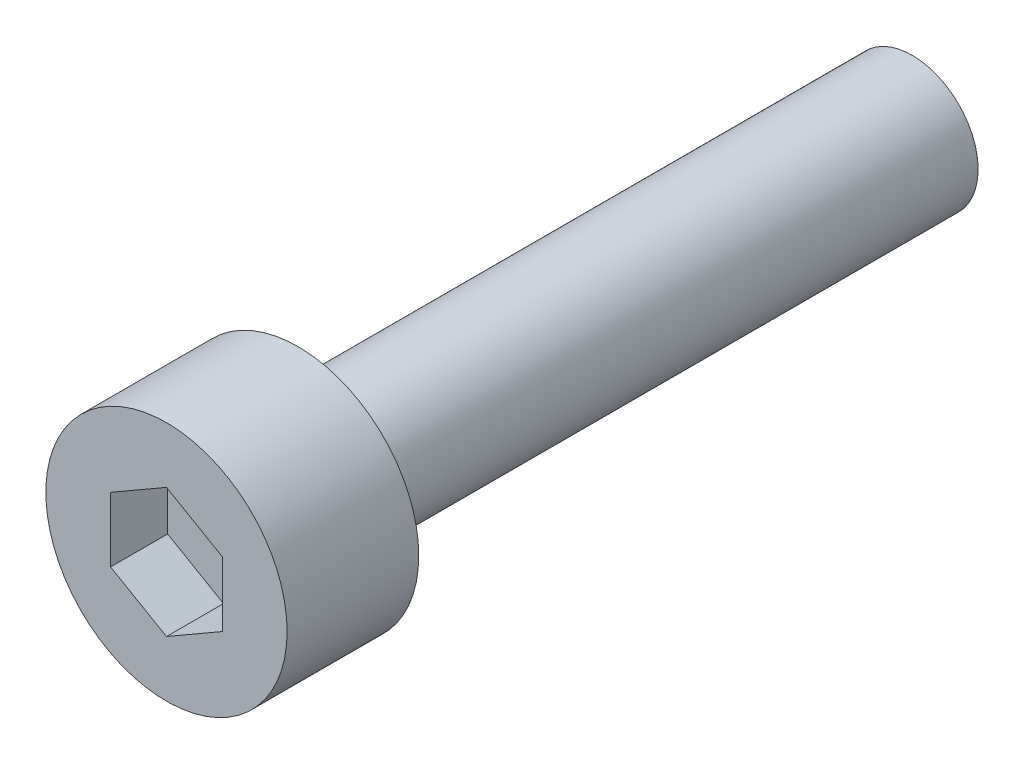
ISO-10303-21;
HEADER;
FILE_DESCRIPTION(('STEP AP214'),'2;1');
FILE_NAME('part.step','',(''),(''),'','','');
FILE_SCHEMA(('AUTOMOTIVE_DESIGN { 1 0 10303 214 1 1 1 1 }'));
ENDSEC;
DATA;
#1=APPLICATION_CONTEXT('core data for automotive mechanical design processes');
#2=APPLICATION_PROTOCOL_DEFINITION('international standard','automotive_design',2000,#1);
#3=PRODUCT_CONTEXT('',#1,'mechanical');
#4=PRODUCT('Part','Part','',(#3));
#5=PRODUCT_RELATED_PRODUCT_CATEGORY('part','',(#4));
#6=PRODUCT_DEFINITION_FORMATION('','',#4);
#7=PRODUCT_DEFINITION_CONTEXT('part definition',#1,'design');
#8=PRODUCT_DEFINITION('design','',#6,#7);
#9=PRODUCT_DEFINITION_SHAPE('','',#8);
#10=(LENGTH_UNIT() NAMED_UNIT(*) SI_UNIT(.MILLI.,.METRE.));
#11=(NAMED_UNIT(*) PLANE_ANGLE_UNIT() SI_UNIT($,.RADIAN.));
#12=(NAMED_UNIT(*) SI_UNIT($,.STERADIAN.) SOLID_ANGLE_UNIT());
#13=UNCERTAINTY_MEASURE_WITH_UNIT(LENGTH_MEASURE(1.E-05),#10,'distance_accuracy_value','');
#14=(GEOMETRIC_REPRESENTATION_CONTEXT(3) GLOBAL_UNCERTAINTY_ASSIGNED_CONTEXT((#13)) GLOBAL_UNIT_ASSIGNED_CONTEXT((#10,
#11,#12)) REPRESENTATION_CONTEXT('',''));
#15=CARTESIAN_POINT('',(0.,0.,0.));
#16=DIRECTION('',(0.,0.,1.));
#17=DIRECTION('',(1.,0.,0.));
#18=AXIS2_PLACEMENT_3D('',#15,#16,#17);
#19=CARTESIAN_POINT('',(0.,0.,3.));
#20=DIRECTION('',(0.,0.,-1.));
#21=DIRECTION('',(-1.,0.,0.));
#22=AXIS2_PLACEMENT_3D('',#19,#20,#21);
#23=CYLINDRICAL_SURFACE('',#22,2.75);
#24=CARTESIAN_POINT('',(0.,0.,3.));
#25=DIRECTION('',(0.,0.,1.));
#26=DIRECTION('',(1.,0.,0.));
#27=AXIS2_PLACEMENT_3D('',#24,#25,#26);
#28=CIRCLE('',#27,2.75);
#29=CARTESIAN_POINT('',(2.75,0.,3.));
#30=VERTEX_POINT('',#29);
#31=EDGE_CURVE('E51',#30,#30,#28,.T.);
#32=ORIENTED_EDGE('',*,*,#31,.F.);
#33=EDGE_LOOP('',(#32));
#34=FACE_BOUND('',#33,.T.);
#35=CARTESIAN_POINT('',(0.,0.,0.));
#36=DIRECTION('',(0.,0.,1.));
#37=DIRECTION('',(1.,0.,0.));
#38=AXIS2_PLACEMENT_3D('',#35,#36,#37);
#39=CIRCLE('',#38,2.75);
#40=CARTESIAN_POINT('',(2.75,0.,0.));
#41=VERTEX_POINT('',#40);
#42=EDGE_CURVE('E46',#41,#41,#39,.T.);
#43=ORIENTED_EDGE('',*,*,#42,.T.);
#44=EDGE_LOOP('',(#43));
#45=FACE_BOUND('',#44,.T.);
#46=ADVANCED_FACE('F43',(#34,#45),#23,.T.);
#47=CARTESIAN_POINT('',(0.,0.,3.));
#48=DIRECTION('',(0.,0.,1.));
#49=DIRECTION('',(1.,0.,0.));
#50=AXIS2_PLACEMENT_3D('',#47,#48,#49);
#51=PLANE('',#50);
#52=DIRECTION('',(0.866025403784439,0.5,0.));
#53=VECTOR('',#52,1.);
#54=CARTESIAN_POINT('',(0.,-1.47224318643355,3.));
#55=LINE('',#54,#53);
#56=CARTESIAN_POINT('',(0.,-1.47224318643355,3.));
#57=VERTEX_POINT('',#56);
#58=CARTESIAN_POINT('',(1.275,-0.736121593216773,3.));
#59=VERTEX_POINT('',#58);
#60=EDGE_CURVE('E59',#57,#59,#55,.T.);
#61=ORIENTED_EDGE('',*,*,#60,.F.);
#62=DIRECTION('',(0.866025403784439,-0.5,0.));
#63=VECTOR('',#62,1.);
#64=CARTESIAN_POINT('',(-1.275,-0.736121593216773,3.));
#65=LINE('',#64,#63);
#66=CARTESIAN_POINT('',(-1.275,-0.736121593216773,3.));
#67=VERTEX_POINT('',#66);
#68=EDGE_CURVE('E143',#67,#57,#65,.T.);
#69=ORIENTED_EDGE('',*,*,#68,.F.);
#70=DIRECTION('',(0.,-1.,0.));
#71=VECTOR('',#70,1.);
#72=CARTESIAN_POINT('',(-1.275,0.736121593216774,3.));
#73=LINE('',#72,#71);
#74=CARTESIAN_POINT('',(-1.275,0.736121593216774,3.));
#75=VERTEX_POINT('',#74);
#76=EDGE_CURVE('E141',#75,#67,#73,.T.);
#77=ORIENTED_EDGE('',*,*,#76,.F.);
#78=DIRECTION('',(-0.866025403784439,-0.5,0.));
#79=VECTOR('',#78,1.);
#80=CARTESIAN_POINT('',(0.,1.47224318643355,3.));
#81=LINE('',#80,#79);
#82=CARTESIAN_POINT('',(0.,1.47224318643355,3.));
#83=VERTEX_POINT('',#82);
#84=EDGE_CURVE('E107',#83,#75,#81,.T.);
#85=ORIENTED_EDGE('',*,*,#84,.F.);
#86=DIRECTION('',(-0.866025403784439,0.5,0.));
#87=VECTOR('',#86,1.);
#88=CARTESIAN_POINT('',(1.275,0.736121593216773,3.));
#89=LINE('',#88,#87);
#90=CARTESIAN_POINT('',(1.275,0.736121593216773,3.));
#91=VERTEX_POINT('',#90);
#92=EDGE_CURVE('E137',#91,#83,#89,.T.);
#93=ORIENTED_EDGE('',*,*,#92,.F.);
#94=DIRECTION('',(0.,1.,0.));
#95=VECTOR('',#94,1.);
#96=CARTESIAN_POINT('',(1.275,-0.736121593216773,3.));
#97=LINE('',#96,#95);
#98=EDGE_CURVE('E133',#59,#91,#97,.T.);
#99=ORIENTED_EDGE('',*,*,#98,.F.);
#100=EDGE_LOOP('',(#61,#69,#77,#85,#93,#99));
#101=FACE_BOUND('',#100,.T.);
#102=ORIENTED_EDGE('',*,*,#31,.T.);
#103=EDGE_LOOP('',(#102));
#104=FACE_BOUND('',#103,.T.);
#105=ADVANCED_FACE('F161',(#101,#104),#51,.T.);
#106=CARTESIAN_POINT('',(0.,0.,0.));
#107=DIRECTION('',(0.,0.,1.));
#108=DIRECTION('',(1.,0.,0.));
#109=AXIS2_PLACEMENT_3D('',#106,#107,#108);
#110=PLANE('',#109);
#111=CARTESIAN_POINT('',(0.,0.,0.));
#112=DIRECTION('',(0.,0.,-1.));
#113=DIRECTION('',(-1.,0.,0.));
#114=AXIS2_PLACEMENT_3D('',#111,#112,#113);
#115=CIRCLE('',#114,1.5);
#116=CARTESIAN_POINT('',(-1.5,0.,0.));
#117=VERTEX_POINT('',#116);
#118=EDGE_CURVE('E11',#117,#117,#115,.T.);
#119=ORIENTED_EDGE('',*,*,#118,.F.);
#120=EDGE_LOOP('',(#119));
#121=FACE_BOUND('',#120,.T.);
#122=ORIENTED_EDGE('',*,*,#42,.F.);
#123=EDGE_LOOP('',(#122));
#124=FACE_BOUND('',#123,.T.);
#125=ADVANCED_FACE('F158',(#121,#124),#110,.F.);
#126=CARTESIAN_POINT('',(0.,-1.47224318643355,1.7));
#127=DIRECTION('',(0.5,-0.866025403784439,0.));
#128=DIRECTION('',(0.866025403784439,0.5,0.));
#129=AXIS2_PLACEMENT_3D('',#126,#127,#128);
#130=PLANE('',#129);
#131=ORIENTED_EDGE('',*,*,#60,.T.);
#132=DIRECTION('',(0.,0.,1.));
#133=VECTOR('',#132,1.);
#134=CARTESIAN_POINT('',(1.275,-0.736121593216773,1.7));
#135=LINE('',#134,#133);
#136=CARTESIAN_POINT('',(1.275,-0.736121593216773,1.7));
#137=VERTEX_POINT('',#136);
#138=EDGE_CURVE('E89',#137,#59,#135,.T.);
#139=ORIENTED_EDGE('',*,*,#138,.F.);
#140=DIRECTION('',(0.866025403784439,0.5,0.));
#141=VECTOR('',#140,1.);
#142=CARTESIAN_POINT('',(0.,-1.47224318643355,1.7));
#143=LINE('',#142,#141);
#144=CARTESIAN_POINT('',(0.,-1.47224318643355,1.7));
#145=VERTEX_POINT('',#144);
#146=EDGE_CURVE('E145',#145,#137,#143,.T.);
#147=ORIENTED_EDGE('',*,*,#146,.F.);
#148=DIRECTION('',(0.,0.,1.));
#149=VECTOR('',#148,1.);
#150=CARTESIAN_POINT('',(0.,-1.47224318643355,1.7));
#151=LINE('',#150,#149);
#152=EDGE_CURVE('E67',#145,#57,#151,.T.);
#153=ORIENTED_EDGE('',*,*,#152,.T.);
#154=EDGE_LOOP('',(#131,#139,#147,#153));
#155=FACE_BOUND('',#154,.T.);
#156=ADVANCED_FACE('F160',(#155),#130,.F.);
#157=CARTESIAN_POINT('',(-1.275,-0.736121593216773,1.7));
#158=DIRECTION('',(-0.5,-0.866025403784439,0.));
#159=DIRECTION('',(0.866025403784439,-0.5,0.));
#160=AXIS2_PLACEMENT_3D('',#157,#158,#159);
#161=PLANE('',#160);
#162=ORIENTED_EDGE('',*,*,#68,.T.);
#163=ORIENTED_EDGE('',*,*,#152,.F.);
#164=DIRECTION('',(0.866025403784439,-0.5,0.));
#165=VECTOR('',#164,1.);
#166=CARTESIAN_POINT('',(-1.275,-0.736121593216773,1.7));
#167=LINE('',#166,#165);
#168=CARTESIAN_POINT('',(-1.275,-0.736121593216773,1.7));
#169=VERTEX_POINT('',#168);
#170=EDGE_CURVE('E119',#169,#145,#167,.T.);
#171=ORIENTED_EDGE('',*,*,#170,.F.);
#172=DIRECTION('',(0.,0.,1.));
#173=VECTOR('',#172,1.);
#174=CARTESIAN_POINT('',(-1.275,-0.736121593216773,1.7));
#175=LINE('',#174,#173);
#176=EDGE_CURVE('E111',#169,#67,#175,.T.);
#177=ORIENTED_EDGE('',*,*,#176,.T.);
#178=EDGE_LOOP('',(#162,#163,#171,#177));
#179=FACE_BOUND('',#178,.T.);
#180=ADVANCED_FACE('F168',(#179),#161,.F.);
#181=CARTESIAN_POINT('',(-1.275,0.736121593216774,1.7));
#182=DIRECTION('',(-1.,0.,0.));
#183=DIRECTION('',(0.,0.,1.));
#184=AXIS2_PLACEMENT_3D('',#181,#182,#183);
#185=PLANE('',#184);
#186=ORIENTED_EDGE('',*,*,#76,.T.);
#187=ORIENTED_EDGE('',*,*,#176,.F.);
#188=DIRECTION('',(0.,-1.,0.));
#189=VECTOR('',#188,1.);
#190=CARTESIAN_POINT('',(-1.275,0.736121593216774,1.7));
#191=LINE('',#190,#189);
#192=CARTESIAN_POINT('',(-1.275,0.736121593216774,1.7));
#193=VERTEX_POINT('',#192);
#194=EDGE_CURVE('E115',#193,#169,#191,.T.);
#195=ORIENTED_EDGE('',*,*,#194,.F.);
#196=DIRECTION('',(0.,0.,1.));
#197=VECTOR('',#196,1.);
#198=CARTESIAN_POINT('',(-1.275,0.736121593216774,1.7));
#199=LINE('',#198,#197);
#200=EDGE_CURVE('E100',#193,#75,#199,.T.);
#201=ORIENTED_EDGE('',*,*,#200,.T.);
#202=EDGE_LOOP('',(#186,#187,#195,#201));
#203=FACE_BOUND('',#202,.T.);
#204=ADVANCED_FACE('F116',(#203),#185,.F.);
#205=CARTESIAN_POINT('',(0.,1.47224318643355,1.7));
#206=DIRECTION('',(-0.5,0.866025403784439,0.));
#207=DIRECTION('',(-0.866025403784439,-0.5,0.));
#208=AXIS2_PLACEMENT_3D('',#205,#206,#207);
#209=PLANE('',#208);
#210=ORIENTED_EDGE('',*,*,#84,.T.);
#211=ORIENTED_EDGE('',*,*,#200,.F.);
#212=DIRECTION('',(-0.866025403784439,-0.5,0.));
#213=VECTOR('',#212,1.);
#214=CARTESIAN_POINT('',(0.,1.47224318643355,1.7));
#215=LINE('',#214,#213);
#216=CARTESIAN_POINT('',(0.,1.47224318643355,1.7));
#217=VERTEX_POINT('',#216);
#218=EDGE_CURVE('E104',#217,#193,#215,.T.);
#219=ORIENTED_EDGE('',*,*,#218,.F.);
#220=DIRECTION('',(0.,0.,1.));
#221=VECTOR('',#220,1.);
#222=CARTESIAN_POINT('',(0.,1.47224318643355,1.7));
#223=LINE('',#222,#221);
#224=EDGE_CURVE('E112',#217,#83,#223,.T.);
#225=ORIENTED_EDGE('',*,*,#224,.T.);
#226=EDGE_LOOP('',(#210,#211,#219,#225));
#227=FACE_BOUND('',#226,.T.);
#228=ADVANCED_FACE('F102',(#227),#209,.F.);
#229=CARTESIAN_POINT('',(1.275,0.736121593216773,1.7));
#230=DIRECTION('',(0.5,0.866025403784439,0.));
#231=DIRECTION('',(-0.866025403784439,0.5,0.));
#232=AXIS2_PLACEMENT_3D('',#229,#230,#231);
#233=PLANE('',#232);
#234=ORIENTED_EDGE('',*,*,#92,.T.);
#235=ORIENTED_EDGE('',*,*,#224,.F.);
#236=DIRECTION('',(-0.866025403784439,0.5,0.));
#237=VECTOR('',#236,1.);
#238=CARTESIAN_POINT('',(1.275,0.736121593216773,1.7));
#239=LINE('',#238,#237);
#240=CARTESIAN_POINT('',(1.275,0.736121593216773,1.7));
#241=VERTEX_POINT('',#240);
#242=EDGE_CURVE('E125',#241,#217,#239,.T.);
#243=ORIENTED_EDGE('',*,*,#242,.F.);
#244=DIRECTION('',(0.,0.,1.));
#245=VECTOR('',#244,1.);
#246=CARTESIAN_POINT('',(1.275,0.736121593216773,1.7));
#247=LINE('',#246,#245);
#248=EDGE_CURVE('E149',#241,#91,#247,.T.);
#249=ORIENTED_EDGE('',*,*,#248,.T.);
#250=EDGE_LOOP('',(#234,#235,#243,#249));
#251=FACE_BOUND('',#250,.T.);
#252=ADVANCED_FACE('F204',(#251),#233,.F.);
#253=CARTESIAN_POINT('',(1.275,-0.736121593216773,1.7));
#254=DIRECTION('',(1.,0.,0.));
#255=DIRECTION('',(0.,0.,-1.));
#256=AXIS2_PLACEMENT_3D('',#253,#254,#255);
#257=PLANE('',#256);
#258=ORIENTED_EDGE('',*,*,#98,.T.);
#259=ORIENTED_EDGE('',*,*,#248,.F.);
#260=DIRECTION('',(0.,1.,0.));
#261=VECTOR('',#260,1.);
#262=CARTESIAN_POINT('',(1.275,-0.736121593216773,1.7));
#263=LINE('',#262,#261);
#264=EDGE_CURVE('E127',#137,#241,#263,.T.);
#265=ORIENTED_EDGE('',*,*,#264,.F.);
#266=ORIENTED_EDGE('',*,*,#138,.T.);
#267=EDGE_LOOP('',(#258,#259,#265,#266));
#268=FACE_BOUND('',#267,.T.);
#269=ADVANCED_FACE('F211',(#268),#257,.F.);
#270=CARTESIAN_POINT('',(0.,0.,1.7));
#271=DIRECTION('',(0.,0.,1.));
#272=DIRECTION('',(1.,0.,0.));
#273=AXIS2_PLACEMENT_3D('',#270,#271,#272);
#274=PLANE('',#273);
#275=ORIENTED_EDGE('',*,*,#146,.T.);
#276=ORIENTED_EDGE('',*,*,#264,.T.);
#277=ORIENTED_EDGE('',*,*,#242,.T.);
#278=ORIENTED_EDGE('',*,*,#218,.T.);
#279=ORIENTED_EDGE('',*,*,#194,.T.);
#280=ORIENTED_EDGE('',*,*,#170,.T.);
#281=EDGE_LOOP('',(#275,#276,#277,#278,#279,#280));
#282=FACE_BOUND('',#281,.T.);
#283=ADVANCED_FACE('F122',(#282),#274,.T.);
#284=CARTESIAN_POINT('',(0.,0.,-14.));
#285=DIRECTION('',(0.,0.,1.));
#286=DIRECTION('',(1.,0.,0.));
#287=AXIS2_PLACEMENT_3D('',#284,#285,#286);
#288=CYLINDRICAL_SURFACE('',#287,1.5);
#289=CARTESIAN_POINT('',(0.,0.,-14.));
#290=DIRECTION('',(0.,0.,-1.));
#291=DIRECTION('',(-1.,0.,0.));
#292=AXIS2_PLACEMENT_3D('',#289,#290,#291);
#293=CIRCLE('',#292,1.5);
#294=CARTESIAN_POINT('',(-1.5,0.,-14.));
#295=VERTEX_POINT('',#294);
#296=EDGE_CURVE('E134',#295,#295,#293,.T.);
#297=ORIENTED_EDGE('',*,*,#296,.F.);
#298=EDGE_LOOP('',(#297));
#299=FACE_BOUND('',#298,.T.);
#300=ORIENTED_EDGE('',*,*,#118,.T.);
#301=EDGE_LOOP('',(#300));
#302=FACE_BOUND('',#301,.T.);
#303=ADVANCED_FACE('F224',(#299,#302),#288,.T.);
#304=CARTESIAN_POINT('',(0.,0.,-14.));
#305=DIRECTION('',(0.,0.,-1.));
#306=DIRECTION('',(-1.,0.,0.));
#307=AXIS2_PLACEMENT_3D('',#304,#305,#306);
#308=PLANE('',#307);
#309=ORIENTED_EDGE('',*,*,#296,.T.);
#310=EDGE_LOOP('',(#309));
#311=FACE_BOUND('',#310,.T.);
#312=ADVANCED_FACE('F233',(#311),#308,.T.);
#313=CLOSED_SHELL('',(#46,#105,#125,#156,#180,#204,#228,#252,#269,#283,#303,#312));
#314=MANIFOLD_SOLID_BREP('B2',#313);
#315=ADVANCED_BREP_SHAPE_REPRESENTATION('',(#18,#314),#14);
#316=SHAPE_DEFINITION_REPRESENTATION(#9,#315);
ENDSEC;
END-ISO-10303-21;
